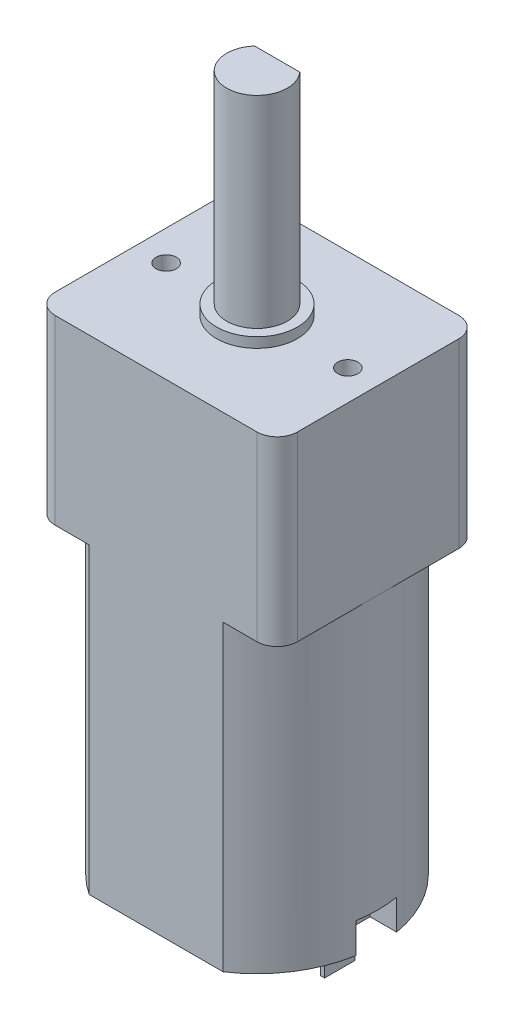
ISO-10303-21;
HEADER;
FILE_DESCRIPTION(('STEP AP214'),'2;1');
FILE_NAME('part.step','',(''),(''),'','','');
FILE_SCHEMA(('AUTOMOTIVE_DESIGN { 1 0 10303 214 1 1 1 1 }'));
ENDSEC;
DATA;
#1=APPLICATION_CONTEXT('core data for automotive mechanical design processes');
#2=APPLICATION_PROTOCOL_DEFINITION('international standard','automotive_design',2000,#1);
#3=PRODUCT_CONTEXT('',#1,'mechanical');
#4=PRODUCT('Part','Part','',(#3));
#5=PRODUCT_RELATED_PRODUCT_CATEGORY('part','',(#4));
#6=PRODUCT_DEFINITION_FORMATION('','',#4);
#7=PRODUCT_DEFINITION_CONTEXT('part definition',#1,'design');
#8=PRODUCT_DEFINITION('design','',#6,#7);
#9=PRODUCT_DEFINITION_SHAPE('','',#8);
#10=(LENGTH_UNIT() NAMED_UNIT(*) SI_UNIT(.MILLI.,.METRE.));
#11=(NAMED_UNIT(*) PLANE_ANGLE_UNIT() SI_UNIT($,.RADIAN.));
#12=(NAMED_UNIT(*) SI_UNIT($,.STERADIAN.) SOLID_ANGLE_UNIT());
#13=UNCERTAINTY_MEASURE_WITH_UNIT(LENGTH_MEASURE(1.E-05),#10,'distance_accuracy_value','');
#14=(GEOMETRIC_REPRESENTATION_CONTEXT(3) GLOBAL_UNCERTAINTY_ASSIGNED_CONTEXT((#13)) GLOBAL_UNIT_ASSIGNED_CONTEXT((#10,
#11,#12)) REPRESENTATION_CONTEXT('',''));
#15=CARTESIAN_POINT('',(0.,0.,0.));
#16=DIRECTION('',(0.,0.,1.));
#17=DIRECTION('',(1.,0.,0.));
#18=AXIS2_PLACEMENT_3D('',#15,#16,#17);
#19=CARTESIAN_POINT('',(5.,24.,-4.));
#20=DIRECTION('',(0.,-1.,0.));
#21=DIRECTION('',(0.,0.,-1.));
#22=AXIS2_PLACEMENT_3D('',#19,#20,#21);
#23=PLANE('',#22);
#24=CARTESIAN_POINT('',(-4.5,24.,0.));
#25=DIRECTION('',(0.,1.,0.));
#26=DIRECTION('',(0.,0.,1.));
#27=AXIS2_PLACEMENT_3D('',#24,#25,#26);
#28=CIRCLE('',#27,0.5);
#29=CARTESIAN_POINT('',(-4.5,24.,0.5));
#30=VERTEX_POINT('',#29);
#31=EDGE_CURVE('E1067',#30,#30,#28,.T.);
#32=ORIENTED_EDGE('',*,*,#31,.F.);
#33=EDGE_LOOP('',(#32));
#34=FACE_BOUND('',#33,.T.);
#35=CARTESIAN_POINT('',(4.5,24.,0.));
#36=DIRECTION('',(0.,1.,0.));
#37=DIRECTION('',(0.,0.,-1.));
#38=AXIS2_PLACEMENT_3D('',#35,#36,#37);
#39=CIRCLE('',#38,0.5);
#40=CARTESIAN_POINT('',(4.5,24.,-0.500000000000001));
#41=VERTEX_POINT('',#40);
#42=EDGE_CURVE('E1077',#41,#41,#39,.T.);
#43=ORIENTED_EDGE('',*,*,#42,.F.);
#44=EDGE_LOOP('',(#43));
#45=FACE_BOUND('',#44,.T.);
#46=CARTESIAN_POINT('',(0.,24.,0.));
#47=DIRECTION('',(0.,-1.,0.));
#48=DIRECTION('',(0.,0.,-1.));
#49=AXIS2_PLACEMENT_3D('',#46,#47,#48);
#50=CIRCLE('',#49,2.);
#51=CARTESIAN_POINT('',(0.,24.,-2.));
#52=VERTEX_POINT('',#51);
#53=EDGE_CURVE('E11',#52,#52,#50,.F.);
#54=ORIENTED_EDGE('',*,*,#53,.F.);
#55=EDGE_LOOP('',(#54));
#56=FACE_BOUND('',#55,.T.);
#57=CARTESIAN_POINT('',(5.,24.,-4.));
#58=DIRECTION('',(0.,1.,0.));
#59=DIRECTION('',(0.,0.,-1.));
#60=AXIS2_PLACEMENT_3D('',#57,#58,#59);
#61=CIRCLE('',#60,1.);
#62=CARTESIAN_POINT('',(6.,24.,-3.99999999999999));
#63=VERTEX_POINT('',#62);
#64=CARTESIAN_POINT('',(4.99999999999999,24.,-5.));
#65=VERTEX_POINT('',#64);
#66=EDGE_CURVE('E280',#63,#65,#61,.T.);
#67=ORIENTED_EDGE('',*,*,#66,.T.);
#68=DIRECTION('',(-1.,0.,0.));
#69=VECTOR('',#68,1.);
#70=CARTESIAN_POINT('',(-4.99999999999999,24.,-5.));
#71=LINE('',#70,#69);
#72=CARTESIAN_POINT('',(-4.99999999999999,24.,-5.));
#73=VERTEX_POINT('',#72);
#74=EDGE_CURVE('E281',#65,#73,#71,.T.);
#75=ORIENTED_EDGE('',*,*,#74,.T.);
#76=CARTESIAN_POINT('',(-5.,24.,-4.));
#77=DIRECTION('',(0.,1.,0.));
#78=DIRECTION('',(0.,0.,1.));
#79=AXIS2_PLACEMENT_3D('',#76,#77,#78);
#80=CIRCLE('',#79,1.);
#81=CARTESIAN_POINT('',(-6.,24.,-3.99999999999999));
#82=VERTEX_POINT('',#81);
#83=EDGE_CURVE('E284',#73,#82,#80,.T.);
#84=ORIENTED_EDGE('',*,*,#83,.T.);
#85=DIRECTION('',(0.,0.,1.));
#86=VECTOR('',#85,1.);
#87=CARTESIAN_POINT('',(-6.,24.,-3.99999999999999));
#88=LINE('',#87,#86);
#89=CARTESIAN_POINT('',(-6.,24.,3.99999999999999));
#90=VERTEX_POINT('',#89);
#91=EDGE_CURVE('E288',#82,#90,#88,.T.);
#92=ORIENTED_EDGE('',*,*,#91,.T.);
#93=CARTESIAN_POINT('',(-5.,24.,4.));
#94=DIRECTION('',(0.,1.,0.));
#95=DIRECTION('',(0.,0.,1.));
#96=AXIS2_PLACEMENT_3D('',#93,#94,#95);
#97=CIRCLE('',#96,1.);
#98=CARTESIAN_POINT('',(-5.,24.,5.));
#99=VERTEX_POINT('',#98);
#100=EDGE_CURVE('E292',#90,#99,#97,.T.);
#101=ORIENTED_EDGE('',*,*,#100,.T.);
#102=DIRECTION('',(1.,0.,0.));
#103=VECTOR('',#102,1.);
#104=CARTESIAN_POINT('',(-4.99999999999999,24.,5.));
#105=LINE('',#104,#103);
#106=CARTESIAN_POINT('',(4.99999999999999,24.,5.));
#107=VERTEX_POINT('',#106);
#108=EDGE_CURVE('E294',#99,#107,#105,.T.);
#109=ORIENTED_EDGE('',*,*,#108,.T.);
#110=CARTESIAN_POINT('',(5.,24.,4.));
#111=DIRECTION('',(0.,1.,0.));
#112=DIRECTION('',(0.,0.,1.));
#113=AXIS2_PLACEMENT_3D('',#110,#111,#112);
#114=CIRCLE('',#113,1.);
#115=CARTESIAN_POINT('',(6.,24.,3.99999999999999));
#116=VERTEX_POINT('',#115);
#117=EDGE_CURVE('E296',#107,#116,#114,.T.);
#118=ORIENTED_EDGE('',*,*,#117,.T.);
#119=DIRECTION('',(0.,0.,-1.));
#120=VECTOR('',#119,1.);
#121=CARTESIAN_POINT('',(6.,24.,-3.99999999999999));
#122=LINE('',#121,#120);
#123=EDGE_CURVE('E297',#116,#63,#122,.T.);
#124=ORIENTED_EDGE('',*,*,#123,.T.);
#125=EDGE_LOOP('',(#67,#75,#84,#92,#101,#109,#118,#124));
#126=FACE_BOUND('',#125,.T.);
#127=ADVANCED_FACE('F42',(#34,#45,#56,#126),#23,.F.);
#128=CARTESIAN_POINT('',(0.,0.,0.));
#129=DIRECTION('',(0.,1.,0.));
#130=DIRECTION('',(0.,0.,1.));
#131=AXIS2_PLACEMENT_3D('',#128,#129,#130);
#132=PLANE('',#131);
#133=DIRECTION('',(0.,0.,1.));
#134=VECTOR('',#133,1.);
#135=CARTESIAN_POINT('',(4.1,0.,0.750000000000001));
#136=LINE('',#135,#134);
#137=CARTESIAN_POINT('',(4.1,0.,-0.75));
#138=VERTEX_POINT('',#137);
#139=CARTESIAN_POINT('',(4.1,0.,0.750000000000001));
#140=VERTEX_POINT('',#139);
#141=EDGE_CURVE('E437',#138,#140,#136,.T.);
#142=ORIENTED_EDGE('',*,*,#141,.F.);
#143=DIRECTION('',(1.,0.,0.));
#144=VECTOR('',#143,1.);
#145=CARTESIAN_POINT('',(4.1,0.,-0.75));
#146=LINE('',#145,#144);
#147=CARTESIAN_POINT('',(3.9,0.,-0.75));
#148=VERTEX_POINT('',#147);
#149=EDGE_CURVE('E481',#148,#138,#146,.T.);
#150=ORIENTED_EDGE('',*,*,#149,.F.);
#151=DIRECTION('',(0.,0.,-1.));
#152=VECTOR('',#151,1.);
#153=CARTESIAN_POINT('',(3.9,0.,0.750000000000001));
#154=LINE('',#153,#152);
#155=CARTESIAN_POINT('',(3.9,0.,0.750000000000001));
#156=VERTEX_POINT('',#155);
#157=EDGE_CURVE('E484',#156,#148,#154,.T.);
#158=ORIENTED_EDGE('',*,*,#157,.F.);
#159=DIRECTION('',(-1.,0.,0.));
#160=VECTOR('',#159,1.);
#161=CARTESIAN_POINT('',(4.1,0.,0.750000000000001));
#162=LINE('',#161,#160);
#163=EDGE_CURVE('E489',#140,#156,#162,.T.);
#164=ORIENTED_EDGE('',*,*,#163,.F.);
#165=EDGE_LOOP('',(#142,#150,#158,#164));
#166=FACE_BOUND('',#165,.T.);
#167=CARTESIAN_POINT('',(0.,0.,0.));
#168=DIRECTION('',(0.,-1.,0.));
#169=DIRECTION('',(0.,0.,-1.));
#170=AXIS2_PLACEMENT_3D('',#167,#168,#169);
#171=CIRCLE('',#170,2.5);
#172=CARTESIAN_POINT('',(0.,0.,-2.5));
#173=VERTEX_POINT('',#172);
#174=EDGE_CURVE('E515',#173,#173,#171,.T.);
#175=ORIENTED_EDGE('',*,*,#174,.F.);
#176=EDGE_LOOP('',(#175));
#177=FACE_BOUND('',#176,.T.);
#178=DIRECTION('',(0.,0.,-1.));
#179=VECTOR('',#178,1.);
#180=CARTESIAN_POINT('',(-4.1,0.,0.75));
#181=LINE('',#180,#179);
#182=CARTESIAN_POINT('',(-4.1,0.,0.75));
#183=VERTEX_POINT('',#182);
#184=CARTESIAN_POINT('',(-4.1,0.,-0.75));
#185=VERTEX_POINT('',#184);
#186=EDGE_CURVE('E433',#183,#185,#181,.T.);
#187=ORIENTED_EDGE('',*,*,#186,.F.);
#188=DIRECTION('',(-1.,0.,0.));
#189=VECTOR('',#188,1.);
#190=CARTESIAN_POINT('',(-4.1,0.,0.75));
#191=LINE('',#190,#189);
#192=CARTESIAN_POINT('',(-3.9,0.,0.75));
#193=VERTEX_POINT('',#192);
#194=EDGE_CURVE('E421',#193,#183,#191,.T.);
#195=ORIENTED_EDGE('',*,*,#194,.F.);
#196=DIRECTION('',(0.,0.,1.));
#197=VECTOR('',#196,1.);
#198=CARTESIAN_POINT('',(-3.9,0.,0.75));
#199=LINE('',#198,#197);
#200=CARTESIAN_POINT('',(-3.9,0.,-0.75));
#201=VERTEX_POINT('',#200);
#202=EDGE_CURVE('E445',#201,#193,#199,.T.);
#203=ORIENTED_EDGE('',*,*,#202,.F.);
#204=DIRECTION('',(1.,0.,0.));
#205=VECTOR('',#204,1.);
#206=CARTESIAN_POINT('',(-4.1,0.,-0.75));
#207=LINE('',#206,#205);
#208=EDGE_CURVE('E440',#185,#201,#207,.T.);
#209=ORIENTED_EDGE('',*,*,#208,.F.);
#210=EDGE_LOOP('',(#187,#195,#203,#209));
#211=FACE_BOUND('',#210,.T.);
#212=DIRECTION('',(1.,0.,0.));
#213=VECTOR('',#212,1.);
#214=CARTESIAN_POINT('',(-6.,0.,-1.));
#215=LINE('',#214,#213);
#216=CARTESIAN_POINT('',(-5.91607978309962,0.,-1.));
#217=VERTEX_POINT('',#216);
#218=CARTESIAN_POINT('',(-4.6,0.,-1.));
#219=VERTEX_POINT('',#218);
#220=EDGE_CURVE('E376',#217,#219,#215,.T.);
#221=ORIENTED_EDGE('',*,*,#220,.F.);
#222=CARTESIAN_POINT('',(0.,0.,0.));
#223=DIRECTION('',(0.,1.,0.));
#224=DIRECTION('',(0.,0.,1.));
#225=AXIS2_PLACEMENT_3D('',#222,#223,#224);
#226=CIRCLE('',#225,6.);
#227=CARTESIAN_POINT('',(-3.3166247903554,0.,-5.));
#228=VERTEX_POINT('',#227);
#229=EDGE_CURVE('E527',#228,#217,#226,.T.);
#230=ORIENTED_EDGE('',*,*,#229,.F.);
#231=DIRECTION('',(-1.,0.,0.));
#232=VECTOR('',#231,1.);
#233=CARTESIAN_POINT('',(-3.3166247903554,0.,-5.));
#234=LINE('',#233,#232);
#235=CARTESIAN_POINT('',(3.3166247903554,0.,-5.));
#236=VERTEX_POINT('',#235);
#237=EDGE_CURVE('E537',#236,#228,#234,.T.);
#238=ORIENTED_EDGE('',*,*,#237,.F.);
#239=CARTESIAN_POINT('',(0.,0.,0.));
#240=DIRECTION('',(0.,1.,0.));
#241=DIRECTION('',(0.,0.,1.));
#242=AXIS2_PLACEMENT_3D('',#239,#240,#241);
#243=CIRCLE('',#242,6.);
#244=CARTESIAN_POINT('',(5.91607978309962,0.,-1.));
#245=VERTEX_POINT('',#244);
#246=EDGE_CURVE('E534',#245,#236,#243,.T.);
#247=ORIENTED_EDGE('',*,*,#246,.F.);
#248=DIRECTION('',(1.,0.,0.));
#249=VECTOR('',#248,1.);
#250=CARTESIAN_POINT('',(6.,0.,-1.));
#251=LINE('',#250,#249);
#252=CARTESIAN_POINT('',(4.6,0.,-1.));
#253=VERTEX_POINT('',#252);
#254=EDGE_CURVE('E399',#253,#245,#251,.T.);
#255=ORIENTED_EDGE('',*,*,#254,.F.);
#256=DIRECTION('',(0.,0.,-1.));
#257=VECTOR('',#256,1.);
#258=CARTESIAN_POINT('',(4.6,0.,1.));
#259=LINE('',#258,#257);
#260=CARTESIAN_POINT('',(4.6,0.,1.));
#261=VERTEX_POINT('',#260);
#262=EDGE_CURVE('E401',#261,#253,#259,.T.);
#263=ORIENTED_EDGE('',*,*,#262,.F.);
#264=DIRECTION('',(-1.,0.,0.));
#265=VECTOR('',#264,1.);
#266=CARTESIAN_POINT('',(6.,0.,1.));
#267=LINE('',#266,#265);
#268=CARTESIAN_POINT('',(5.91607978309962,0.,1.));
#269=VERTEX_POINT('',#268);
#270=EDGE_CURVE('E379',#269,#261,#267,.T.);
#271=ORIENTED_EDGE('',*,*,#270,.F.);
#272=CARTESIAN_POINT('',(3.3166247903554,0.,5.));
#273=VERTEX_POINT('',#272);
#274=EDGE_CURVE('E532',#273,#269,#243,.T.);
#275=ORIENTED_EDGE('',*,*,#274,.F.);
#276=DIRECTION('',(1.,0.,0.));
#277=VECTOR('',#276,1.);
#278=CARTESIAN_POINT('',(-3.3166247903554,0.,5.));
#279=LINE('',#278,#277);
#280=CARTESIAN_POINT('',(-3.3166247903554,0.,5.));
#281=VERTEX_POINT('',#280);
#282=EDGE_CURVE('E533',#281,#273,#279,.T.);
#283=ORIENTED_EDGE('',*,*,#282,.F.);
#284=CARTESIAN_POINT('',(-5.91607978309962,0.,1.));
#285=VERTEX_POINT('',#284);
#286=EDGE_CURVE('E512',#285,#281,#226,.T.);
#287=ORIENTED_EDGE('',*,*,#286,.F.);
#288=DIRECTION('',(-1.,0.,0.));
#289=VECTOR('',#288,1.);
#290=CARTESIAN_POINT('',(-6.,0.,1.));
#291=LINE('',#290,#289);
#292=CARTESIAN_POINT('',(-4.6,0.,1.));
#293=VERTEX_POINT('',#292);
#294=EDGE_CURVE('E370',#293,#285,#291,.T.);
#295=ORIENTED_EDGE('',*,*,#294,.F.);
#296=DIRECTION('',(0.,0.,1.));
#297=VECTOR('',#296,1.);
#298=CARTESIAN_POINT('',(-4.6,0.,1.));
#299=LINE('',#298,#297);
#300=EDGE_CURVE('E377',#219,#293,#299,.T.);
#301=ORIENTED_EDGE('',*,*,#300,.F.);
#302=EDGE_LOOP('',(#221,#230,#238,#247,#255,#263,#271,#275,#283,#287,#295,#301));
#303=FACE_BOUND('',#302,.T.);
#304=ADVANCED_FACE('F584',(#166,#177,#211,#303),#132,.F.);
#305=CARTESIAN_POINT('',(0.,15.,0.));
#306=DIRECTION('',(0.,-1.,0.));
#307=DIRECTION('',(0.,0.,-1.));
#308=AXIS2_PLACEMENT_3D('',#305,#306,#307);
#309=CYLINDRICAL_SURFACE('',#308,6.);
#310=CARTESIAN_POINT('',(0.,1.5,0.));
#311=DIRECTION('',(0.,-1.,0.));
#312=DIRECTION('',(0.,0.,-1.));
#313=AXIS2_PLACEMENT_3D('',#310,#311,#312);
#314=CIRCLE('',#313,6.);
#315=CARTESIAN_POINT('',(-5.91607978309962,1.5,1.));
#316=VERTEX_POINT('',#315);
#317=CARTESIAN_POINT('',(-5.91607978309962,1.5,-1.));
#318=VERTEX_POINT('',#317);
#319=EDGE_CURVE('E570',#316,#318,#314,.T.);
#320=ORIENTED_EDGE('',*,*,#319,.F.);
#321=DIRECTION('',(0.,-1.,0.));
#322=VECTOR('',#321,1.);
#323=CARTESIAN_POINT('',(-5.91607978309962,15.,1.));
#324=LINE('',#323,#322);
#325=EDGE_CURVE('E252',#316,#285,#324,.T.);
#326=ORIENTED_EDGE('',*,*,#325,.T.);
#327=ORIENTED_EDGE('',*,*,#286,.T.);
#328=DIRECTION('',(0.,-1.,0.));
#329=VECTOR('',#328,1.);
#330=CARTESIAN_POINT('',(-3.3166247903554,15.,5.));
#331=LINE('',#330,#329);
#332=CARTESIAN_POINT('',(-3.3166247903554,15.,5.));
#333=VERTEX_POINT('',#332);
#334=EDGE_CURVE('E516',#333,#281,#331,.T.);
#335=ORIENTED_EDGE('',*,*,#334,.F.);
#336=CARTESIAN_POINT('',(0.,15.,0.));
#337=DIRECTION('',(0.,1.,0.));
#338=DIRECTION('',(0.,0.,1.));
#339=AXIS2_PLACEMENT_3D('',#336,#337,#338);
#340=CIRCLE('',#339,6.);
#341=CARTESIAN_POINT('',(-6.,15.,0.));
#342=VERTEX_POINT('',#341);
#343=EDGE_CURVE('E525',#342,#333,#340,.T.);
#344=ORIENTED_EDGE('',*,*,#343,.F.);
#345=CARTESIAN_POINT('',(-3.3166247903554,15.,-5.));
#346=VERTEX_POINT('',#345);
#347=EDGE_CURVE('E520',#346,#342,#340,.T.);
#348=ORIENTED_EDGE('',*,*,#347,.F.);
#349=DIRECTION('',(0.,-1.,0.));
#350=VECTOR('',#349,1.);
#351=CARTESIAN_POINT('',(-3.3166247903554,15.,-5.));
#352=LINE('',#351,#350);
#353=EDGE_CURVE('E528',#346,#228,#352,.T.);
#354=ORIENTED_EDGE('',*,*,#353,.T.);
#355=ORIENTED_EDGE('',*,*,#229,.T.);
#356=DIRECTION('',(0.,-1.,0.));
#357=VECTOR('',#356,1.);
#358=CARTESIAN_POINT('',(-5.91607978309962,15.,-1.));
#359=LINE('',#358,#357);
#360=EDGE_CURVE('E568',#217,#318,#359,.F.);
#361=ORIENTED_EDGE('',*,*,#360,.T.);
#362=EDGE_LOOP('',(#320,#326,#327,#335,#344,#348,#354,#355,#361));
#363=FACE_BOUND('',#362,.T.);
#364=ADVANCED_FACE('F46',(#363),#309,.T.);
#365=CARTESIAN_POINT('',(-3.3166247903554,15.,5.));
#366=DIRECTION('',(0.,0.,-1.));
#367=DIRECTION('',(-1.,0.,0.));
#368=AXIS2_PLACEMENT_3D('',#365,#366,#367);
#369=PLANE('',#368);
#370=ORIENTED_EDGE('',*,*,#282,.T.);
#371=DIRECTION('',(0.,-1.,0.));
#372=VECTOR('',#371,1.);
#373=CARTESIAN_POINT('',(3.3166247903554,15.,5.));
#374=LINE('',#373,#372);
#375=CARTESIAN_POINT('',(3.3166247903554,15.,5.));
#376=VERTEX_POINT('',#375);
#377=EDGE_CURVE('E548',#376,#273,#374,.T.);
#378=ORIENTED_EDGE('',*,*,#377,.F.);
#379=DIRECTION('',(1.,0.,0.));
#380=VECTOR('',#379,1.);
#381=CARTESIAN_POINT('',(-4.99999999999999,15.,5.));
#382=LINE('',#381,#380);
#383=CARTESIAN_POINT('',(4.99999999999999,15.,5.));
#384=VERTEX_POINT('',#383);
#385=EDGE_CURVE('E317',#376,#384,#382,.T.);
#386=ORIENTED_EDGE('',*,*,#385,.T.);
#387=DIRECTION('',(0.,-1.,0.));
#388=VECTOR('',#387,1.);
#389=CARTESIAN_POINT('',(4.99999999999999,24.,5.));
#390=LINE('',#389,#388);
#391=EDGE_CURVE('E337',#107,#384,#390,.T.);
#392=ORIENTED_EDGE('',*,*,#391,.F.);
#393=ORIENTED_EDGE('',*,*,#108,.F.);
#394=DIRECTION('',(0.,-1.,0.));
#395=VECTOR('',#394,1.);
#396=CARTESIAN_POINT('',(-5.,24.,5.));
#397=LINE('',#396,#395);
#398=CARTESIAN_POINT('',(-5.,15.,5.));
#399=VERTEX_POINT('',#398);
#400=EDGE_CURVE('E345',#99,#399,#397,.T.);
#401=ORIENTED_EDGE('',*,*,#400,.T.);
#402=EDGE_CURVE('E319',#399,#333,#382,.T.);
#403=ORIENTED_EDGE('',*,*,#402,.T.);
#404=ORIENTED_EDGE('',*,*,#334,.T.);
#405=EDGE_LOOP('',(#370,#378,#386,#392,#393,#401,#403,#404));
#406=FACE_BOUND('',#405,.T.);
#407=ADVANCED_FACE('F636',(#406),#369,.F.);
#408=CARTESIAN_POINT('',(0.,15.,0.));
#409=DIRECTION('',(0.,-1.,0.));
#410=DIRECTION('',(0.,0.,-1.));
#411=AXIS2_PLACEMENT_3D('',#408,#409,#410);
#412=CYLINDRICAL_SURFACE('',#411,6.);
#413=CARTESIAN_POINT('',(0.,1.5,0.));
#414=DIRECTION('',(0.,1.,0.));
#415=DIRECTION('',(0.,0.,1.));
#416=AXIS2_PLACEMENT_3D('',#413,#414,#415);
#417=CIRCLE('',#416,6.);
#418=CARTESIAN_POINT('',(5.91607978309962,1.5,1.));
#419=VERTEX_POINT('',#418);
#420=CARTESIAN_POINT('',(5.91607978309962,1.5,-1.));
#421=VERTEX_POINT('',#420);
#422=EDGE_CURVE('E519',#419,#421,#417,.T.);
#423=ORIENTED_EDGE('',*,*,#422,.T.);
#424=DIRECTION('',(0.,-1.,0.));
#425=VECTOR('',#424,1.);
#426=CARTESIAN_POINT('',(5.91607978309962,15.,-1.));
#427=LINE('',#426,#425);
#428=EDGE_CURVE('E563',#421,#245,#427,.T.);
#429=ORIENTED_EDGE('',*,*,#428,.T.);
#430=ORIENTED_EDGE('',*,*,#246,.T.);
#431=DIRECTION('',(0.,-1.,0.));
#432=VECTOR('',#431,1.);
#433=CARTESIAN_POINT('',(3.3166247903554,15.,-5.));
#434=LINE('',#433,#432);
#435=CARTESIAN_POINT('',(3.3166247903554,15.,-5.));
#436=VERTEX_POINT('',#435);
#437=EDGE_CURVE('E544',#436,#236,#434,.T.);
#438=ORIENTED_EDGE('',*,*,#437,.F.);
#439=CARTESIAN_POINT('',(0.,15.,0.));
#440=DIRECTION('',(0.,1.,0.));
#441=DIRECTION('',(0.,0.,1.));
#442=AXIS2_PLACEMENT_3D('',#439,#440,#441);
#443=CIRCLE('',#442,6.);
#444=CARTESIAN_POINT('',(6.,15.,0.));
#445=VERTEX_POINT('',#444);
#446=EDGE_CURVE('E70',#445,#436,#443,.T.);
#447=ORIENTED_EDGE('',*,*,#446,.F.);
#448=EDGE_CURVE('E523',#376,#445,#443,.T.);
#449=ORIENTED_EDGE('',*,*,#448,.F.);
#450=ORIENTED_EDGE('',*,*,#377,.T.);
#451=ORIENTED_EDGE('',*,*,#274,.T.);
#452=DIRECTION('',(0.,-1.,0.));
#453=VECTOR('',#452,1.);
#454=CARTESIAN_POINT('',(5.91607978309962,15.,1.));
#455=LINE('',#454,#453);
#456=EDGE_CURVE('E558',#269,#419,#455,.F.);
#457=ORIENTED_EDGE('',*,*,#456,.T.);
#458=EDGE_LOOP('',(#423,#429,#430,#438,#447,#449,#450,#451,#457));
#459=FACE_BOUND('',#458,.T.);
#460=ADVANCED_FACE('F630',(#459),#412,.T.);
#461=CARTESIAN_POINT('',(-3.3166247903554,15.,-5.));
#462=DIRECTION('',(0.,0.,1.));
#463=DIRECTION('',(1.,0.,0.));
#464=AXIS2_PLACEMENT_3D('',#461,#462,#463);
#465=PLANE('',#464);
#466=ORIENTED_EDGE('',*,*,#237,.T.);
#467=ORIENTED_EDGE('',*,*,#353,.F.);
#468=DIRECTION('',(-1.,0.,0.));
#469=VECTOR('',#468,1.);
#470=CARTESIAN_POINT('',(-4.99999999999999,15.,-5.));
#471=LINE('',#470,#469);
#472=CARTESIAN_POINT('',(-4.99999999999999,15.,-5.));
#473=VERTEX_POINT('',#472);
#474=EDGE_CURVE('E275',#346,#473,#471,.T.);
#475=ORIENTED_EDGE('',*,*,#474,.T.);
#476=DIRECTION('',(0.,-1.,0.));
#477=VECTOR('',#476,1.);
#478=CARTESIAN_POINT('',(-4.99999999999999,24.,-5.));
#479=LINE('',#478,#477);
#480=EDGE_CURVE('E353',#73,#473,#479,.T.);
#481=ORIENTED_EDGE('',*,*,#480,.F.);
#482=ORIENTED_EDGE('',*,*,#74,.F.);
#483=DIRECTION('',(0.,-1.,0.));
#484=VECTOR('',#483,1.);
#485=CARTESIAN_POINT('',(4.99999999999999,24.,-5.));
#486=LINE('',#485,#484);
#487=CARTESIAN_POINT('',(4.99999999999999,15.,-5.));
#488=VERTEX_POINT('',#487);
#489=EDGE_CURVE('E358',#65,#488,#486,.T.);
#490=ORIENTED_EDGE('',*,*,#489,.T.);
#491=EDGE_CURVE('E304',#488,#436,#471,.T.);
#492=ORIENTED_EDGE('',*,*,#491,.T.);
#493=ORIENTED_EDGE('',*,*,#437,.T.);
#494=EDGE_LOOP('',(#466,#467,#475,#481,#482,#490,#492,#493));
#495=FACE_BOUND('',#494,.T.);
#496=ADVANCED_FACE('F596',(#495),#465,.F.);
#497=CARTESIAN_POINT('',(0.,-1.2,0.));
#498=DIRECTION('',(0.,1.,0.));
#499=DIRECTION('',(0.,0.,1.));
#500=AXIS2_PLACEMENT_3D('',#497,#498,#499);
#501=CYLINDRICAL_SURFACE('',#500,2.5);
#502=CARTESIAN_POINT('',(0.,-1.2,0.));
#503=DIRECTION('',(0.,-1.,0.));
#504=DIRECTION('',(0.,0.,-1.));
#505=AXIS2_PLACEMENT_3D('',#502,#503,#504);
#506=CIRCLE('',#505,2.5);
#507=CARTESIAN_POINT('',(0.,-1.2,-2.5));
#508=VERTEX_POINT('',#507);
#509=EDGE_CURVE('E463',#508,#508,#506,.T.);
#510=ORIENTED_EDGE('',*,*,#509,.F.);
#511=EDGE_LOOP('',(#510));
#512=FACE_BOUND('',#511,.T.);
#513=ORIENTED_EDGE('',*,*,#174,.T.);
#514=EDGE_LOOP('',(#513));
#515=FACE_BOUND('',#514,.T.);
#516=ADVANCED_FACE('F750',(#512,#515),#501,.T.);
#517=CARTESIAN_POINT('',(0.,-1.2,0.));
#518=DIRECTION('',(0.,-1.,0.));
#519=DIRECTION('',(0.,0.,-1.));
#520=AXIS2_PLACEMENT_3D('',#517,#518,#519);
#521=PLANE('',#520);
#522=ORIENTED_EDGE('',*,*,#509,.T.);
#523=EDGE_LOOP('',(#522));
#524=FACE_BOUND('',#523,.T.);
#525=ADVANCED_FACE('F732',(#524),#521,.T.);
#526=CARTESIAN_POINT('',(4.1,-2.,0.750000000000001));
#527=DIRECTION('',(-1.,0.,0.));
#528=DIRECTION('',(0.,0.,1.));
#529=AXIS2_PLACEMENT_3D('',#526,#527,#528);
#530=PLANE('',#529);
#531=ORIENTED_EDGE('',*,*,#141,.T.);
#532=DIRECTION('',(0.,1.,0.));
#533=VECTOR('',#532,1.);
#534=CARTESIAN_POINT('',(4.1,-2.,0.750000000000001));
#535=LINE('',#534,#533);
#536=CARTESIAN_POINT('',(4.1,-2.,0.750000000000001));
#537=VERTEX_POINT('',#536);
#538=EDGE_CURVE('E386',#537,#140,#535,.T.);
#539=ORIENTED_EDGE('',*,*,#538,.F.);
#540=DIRECTION('',(0.,0.,1.));
#541=VECTOR('',#540,1.);
#542=CARTESIAN_POINT('',(4.1,-2.,0.750000000000001));
#543=LINE('',#542,#541);
#544=CARTESIAN_POINT('',(4.1,-2.,-0.75));
#545=VERTEX_POINT('',#544);
#546=EDGE_CURVE('E486',#545,#537,#543,.T.);
#547=ORIENTED_EDGE('',*,*,#546,.F.);
#548=DIRECTION('',(0.,1.,0.));
#549=VECTOR('',#548,1.);
#550=CARTESIAN_POINT('',(4.1,-2.,-0.75));
#551=LINE('',#550,#549);
#552=EDGE_CURVE('E478',#545,#138,#551,.T.);
#553=ORIENTED_EDGE('',*,*,#552,.T.);
#554=EDGE_LOOP('',(#531,#539,#547,#553));
#555=FACE_BOUND('',#554,.T.);
#556=ADVANCED_FACE('F730',(#555),#530,.F.);
#557=CARTESIAN_POINT('',(4.1,-2.,0.750000000000001));
#558=DIRECTION('',(0.,0.,-1.));
#559=DIRECTION('',(-1.,0.,0.));
#560=AXIS2_PLACEMENT_3D('',#557,#558,#559);
#561=PLANE('',#560);
#562=ORIENTED_EDGE('',*,*,#163,.T.);
#563=DIRECTION('',(0.,1.,0.));
#564=VECTOR('',#563,1.);
#565=CARTESIAN_POINT('',(3.9,-2.,0.750000000000001));
#566=LINE('',#565,#564);
#567=CARTESIAN_POINT('',(3.9,-2.,0.750000000000001));
#568=VERTEX_POINT('',#567);
#569=EDGE_CURVE('E468',#568,#156,#566,.T.);
#570=ORIENTED_EDGE('',*,*,#569,.F.);
#571=DIRECTION('',(-1.,0.,0.));
#572=VECTOR('',#571,1.);
#573=CARTESIAN_POINT('',(4.1,-2.,0.750000000000001));
#574=LINE('',#573,#572);
#575=EDGE_CURVE('E505',#537,#568,#574,.T.);
#576=ORIENTED_EDGE('',*,*,#575,.F.);
#577=ORIENTED_EDGE('',*,*,#538,.T.);
#578=EDGE_LOOP('',(#562,#570,#576,#577));
#579=FACE_BOUND('',#578,.T.);
#580=ADVANCED_FACE('F729',(#579),#561,.F.);
#581=CARTESIAN_POINT('',(3.9,-2.,0.750000000000001));
#582=DIRECTION('',(1.,0.,0.));
#583=DIRECTION('',(0.,0.,-1.));
#584=AXIS2_PLACEMENT_3D('',#581,#582,#583);
#585=PLANE('',#584);
#586=ORIENTED_EDGE('',*,*,#157,.T.);
#587=DIRECTION('',(0.,1.,0.));
#588=VECTOR('',#587,1.);
#589=CARTESIAN_POINT('',(3.9,-2.,-0.75));
#590=LINE('',#589,#588);
#591=CARTESIAN_POINT('',(3.9,-2.,-0.75));
#592=VERTEX_POINT('',#591);
#593=EDGE_CURVE('E472',#592,#148,#590,.T.);
#594=ORIENTED_EDGE('',*,*,#593,.F.);
#595=DIRECTION('',(0.,0.,-1.));
#596=VECTOR('',#595,1.);
#597=CARTESIAN_POINT('',(3.9,-2.,0.750000000000001));
#598=LINE('',#597,#596);
#599=EDGE_CURVE('E496',#568,#592,#598,.T.);
#600=ORIENTED_EDGE('',*,*,#599,.F.);
#601=ORIENTED_EDGE('',*,*,#569,.T.);
#602=EDGE_LOOP('',(#586,#594,#600,#601));
#603=FACE_BOUND('',#602,.T.);
#604=ADVANCED_FACE('F733',(#603),#585,.F.);
#605=CARTESIAN_POINT('',(4.1,-2.,-0.75));
#606=DIRECTION('',(0.,0.,1.));
#607=DIRECTION('',(1.,0.,0.));
#608=AXIS2_PLACEMENT_3D('',#605,#606,#607);
#609=PLANE('',#608);
#610=ORIENTED_EDGE('',*,*,#149,.T.);
#611=ORIENTED_EDGE('',*,*,#552,.F.);
#612=DIRECTION('',(1.,0.,0.));
#613=VECTOR('',#612,1.);
#614=CARTESIAN_POINT('',(4.1,-2.,-0.75));
#615=LINE('',#614,#613);
#616=EDGE_CURVE('E477',#592,#545,#615,.T.);
#617=ORIENTED_EDGE('',*,*,#616,.F.);
#618=ORIENTED_EDGE('',*,*,#593,.T.);
#619=EDGE_LOOP('',(#610,#611,#617,#618));
#620=FACE_BOUND('',#619,.T.);
#621=ADVANCED_FACE('F738',(#620),#609,.F.);
#622=CARTESIAN_POINT('',(0.,-2.,0.));
#623=DIRECTION('',(0.,1.,0.));
#624=DIRECTION('',(0.,0.,1.));
#625=AXIS2_PLACEMENT_3D('',#622,#623,#624);
#626=PLANE('',#625);
#627=ORIENTED_EDGE('',*,*,#546,.T.);
#628=ORIENTED_EDGE('',*,*,#575,.T.);
#629=ORIENTED_EDGE('',*,*,#599,.T.);
#630=ORIENTED_EDGE('',*,*,#616,.T.);
#631=EDGE_LOOP('',(#627,#628,#629,#630));
#632=FACE_BOUND('',#631,.T.);
#633=ADVANCED_FACE('F724',(#632),#626,.F.);
#634=CARTESIAN_POINT('',(-4.1,-2.,0.75));
#635=DIRECTION('',(1.,0.,0.));
#636=DIRECTION('',(0.,0.,-1.));
#637=AXIS2_PLACEMENT_3D('',#634,#635,#636);
#638=PLANE('',#637);
#639=ORIENTED_EDGE('',*,*,#186,.T.);
#640=DIRECTION('',(0.,1.,0.));
#641=VECTOR('',#640,1.);
#642=CARTESIAN_POINT('',(-4.1,-2.,-0.75));
#643=LINE('',#642,#641);
#644=CARTESIAN_POINT('',(-4.1,-2.,-0.75));
#645=VERTEX_POINT('',#644);
#646=EDGE_CURVE('E458',#645,#185,#643,.T.);
#647=ORIENTED_EDGE('',*,*,#646,.F.);
#648=DIRECTION('',(0.,0.,-1.));
#649=VECTOR('',#648,1.);
#650=CARTESIAN_POINT('',(-4.1,-2.,0.75));
#651=LINE('',#650,#649);
#652=CARTESIAN_POINT('',(-4.1,-2.,0.75));
#653=VERTEX_POINT('',#652);
#654=EDGE_CURVE('E416',#653,#645,#651,.T.);
#655=ORIENTED_EDGE('',*,*,#654,.F.);
#656=DIRECTION('',(0.,1.,0.));
#657=VECTOR('',#656,1.);
#658=CARTESIAN_POINT('',(-4.1,-2.,0.75));
#659=LINE('',#658,#657);
#660=EDGE_CURVE('E435',#653,#183,#659,.T.);
#661=ORIENTED_EDGE('',*,*,#660,.T.);
#662=EDGE_LOOP('',(#639,#647,#655,#661));
#663=FACE_BOUND('',#662,.T.);
#664=ADVANCED_FACE('F721',(#663),#638,.F.);
#665=CARTESIAN_POINT('',(-4.1,-2.,-0.75));
#666=DIRECTION('',(0.,0.,1.));
#667=DIRECTION('',(1.,0.,0.));
#668=AXIS2_PLACEMENT_3D('',#665,#666,#667);
#669=PLANE('',#668);
#670=ORIENTED_EDGE('',*,*,#208,.T.);
#671=DIRECTION('',(0.,1.,0.));
#672=VECTOR('',#671,1.);
#673=CARTESIAN_POINT('',(-3.9,-2.,-0.75));
#674=LINE('',#673,#672);
#675=CARTESIAN_POINT('',(-3.9,-2.,-0.75));
#676=VERTEX_POINT('',#675);
#677=EDGE_CURVE('E457',#676,#201,#674,.T.);
#678=ORIENTED_EDGE('',*,*,#677,.F.);
#679=DIRECTION('',(1.,0.,0.));
#680=VECTOR('',#679,1.);
#681=CARTESIAN_POINT('',(-4.1,-2.,-0.75));
#682=LINE('',#681,#680);
#683=EDGE_CURVE('E425',#645,#676,#682,.T.);
#684=ORIENTED_EDGE('',*,*,#683,.F.);
#685=ORIENTED_EDGE('',*,*,#646,.T.);
#686=EDGE_LOOP('',(#670,#678,#684,#685));
#687=FACE_BOUND('',#686,.T.);
#688=ADVANCED_FACE('F720',(#687),#669,.F.);
#689=CARTESIAN_POINT('',(-3.9,-2.,0.75));
#690=DIRECTION('',(-1.,0.,0.));
#691=DIRECTION('',(0.,0.,1.));
#692=AXIS2_PLACEMENT_3D('',#689,#690,#691);
#693=PLANE('',#692);
#694=ORIENTED_EDGE('',*,*,#202,.T.);
#695=DIRECTION('',(0.,1.,0.));
#696=VECTOR('',#695,1.);
#697=CARTESIAN_POINT('',(-3.9,-2.,0.75));
#698=LINE('',#697,#696);
#699=CARTESIAN_POINT('',(-3.9,-2.,0.75));
#700=VERTEX_POINT('',#699);
#701=EDGE_CURVE('E455',#700,#193,#698,.T.);
#702=ORIENTED_EDGE('',*,*,#701,.F.);
#703=DIRECTION('',(0.,0.,1.));
#704=VECTOR('',#703,1.);
#705=CARTESIAN_POINT('',(-3.9,-2.,0.75));
#706=LINE('',#705,#704);
#707=EDGE_CURVE('E426',#676,#700,#706,.T.);
#708=ORIENTED_EDGE('',*,*,#707,.F.);
#709=ORIENTED_EDGE('',*,*,#677,.T.);
#710=EDGE_LOOP('',(#694,#702,#708,#709));
#711=FACE_BOUND('',#710,.T.);
#712=ADVANCED_FACE('F712',(#711),#693,.F.);
#713=CARTESIAN_POINT('',(-4.1,-2.,0.75));
#714=DIRECTION('',(0.,0.,-1.));
#715=DIRECTION('',(-1.,0.,0.));
#716=AXIS2_PLACEMENT_3D('',#713,#714,#715);
#717=PLANE('',#716);
#718=ORIENTED_EDGE('',*,*,#194,.T.);
#719=ORIENTED_EDGE('',*,*,#660,.F.);
#720=DIRECTION('',(-1.,0.,0.));
#721=VECTOR('',#720,1.);
#722=CARTESIAN_POINT('',(-4.1,-2.,0.75));
#723=LINE('',#722,#721);
#724=EDGE_CURVE('E427',#700,#653,#723,.T.);
#725=ORIENTED_EDGE('',*,*,#724,.F.);
#726=ORIENTED_EDGE('',*,*,#701,.T.);
#727=EDGE_LOOP('',(#718,#719,#725,#726));
#728=FACE_BOUND('',#727,.T.);
#729=ADVANCED_FACE('F702',(#728),#717,.F.);
#730=CARTESIAN_POINT('',(0.,-2.,0.));
#731=DIRECTION('',(0.,-1.,0.));
#732=DIRECTION('',(0.,0.,-1.));
#733=AXIS2_PLACEMENT_3D('',#730,#731,#732);
#734=PLANE('',#733);
#735=ORIENTED_EDGE('',*,*,#654,.T.);
#736=ORIENTED_EDGE('',*,*,#683,.T.);
#737=ORIENTED_EDGE('',*,*,#707,.T.);
#738=ORIENTED_EDGE('',*,*,#724,.T.);
#739=EDGE_LOOP('',(#735,#736,#737,#738));
#740=FACE_BOUND('',#739,.T.);
#741=ADVANCED_FACE('F700',(#740),#734,.T.);
#742=CARTESIAN_POINT('',(6.,1.5,-1.));
#743=DIRECTION('',(0.,0.,-1.));
#744=DIRECTION('',(-1.,0.,0.));
#745=AXIS2_PLACEMENT_3D('',#742,#743,#744);
#746=PLANE('',#745);
#747=DIRECTION('',(1.,0.,0.));
#748=VECTOR('',#747,1.);
#749=CARTESIAN_POINT('',(6.,1.5,-1.));
#750=LINE('',#749,#748);
#751=CARTESIAN_POINT('',(4.6,1.5,-1.));
#752=VERTEX_POINT('',#751);
#753=EDGE_CURVE('E400',#752,#421,#750,.T.);
#754=ORIENTED_EDGE('',*,*,#753,.F.);
#755=DIRECTION('',(0.,-1.,0.));
#756=VECTOR('',#755,1.);
#757=CARTESIAN_POINT('',(4.6,1.5,-1.));
#758=LINE('',#757,#756);
#759=EDGE_CURVE('E362',#752,#253,#758,.T.);
#760=ORIENTED_EDGE('',*,*,#759,.T.);
#761=ORIENTED_EDGE('',*,*,#254,.T.);
#762=ORIENTED_EDGE('',*,*,#428,.F.);
#763=EDGE_LOOP('',(#754,#760,#761,#762));
#764=FACE_BOUND('',#763,.T.);
#765=ADVANCED_FACE('F694',(#764),#746,.F.);
#766=CARTESIAN_POINT('',(6.,1.5,1.));
#767=DIRECTION('',(0.,0.,1.));
#768=DIRECTION('',(1.,0.,0.));
#769=AXIS2_PLACEMENT_3D('',#766,#767,#768);
#770=PLANE('',#769);
#771=ORIENTED_EDGE('',*,*,#270,.T.);
#772=DIRECTION('',(0.,-1.,0.));
#773=VECTOR('',#772,1.);
#774=CARTESIAN_POINT('',(4.6,1.5,1.));
#775=LINE('',#774,#773);
#776=CARTESIAN_POINT('',(4.6,1.5,1.));
#777=VERTEX_POINT('',#776);
#778=EDGE_CURVE('E392',#777,#261,#775,.T.);
#779=ORIENTED_EDGE('',*,*,#778,.F.);
#780=DIRECTION('',(-1.,0.,0.));
#781=VECTOR('',#780,1.);
#782=CARTESIAN_POINT('',(6.,1.5,1.));
#783=LINE('',#782,#781);
#784=EDGE_CURVE('E404',#419,#777,#783,.T.);
#785=ORIENTED_EDGE('',*,*,#784,.F.);
#786=ORIENTED_EDGE('',*,*,#456,.F.);
#787=EDGE_LOOP('',(#771,#779,#785,#786));
#788=FACE_BOUND('',#787,.T.);
#789=ADVANCED_FACE('F687',(#788),#770,.F.);
#790=CARTESIAN_POINT('',(0.,1.5,0.));
#791=DIRECTION('',(0.,1.,0.));
#792=DIRECTION('',(0.,0.,1.));
#793=AXIS2_PLACEMENT_3D('',#790,#791,#792);
#794=PLANE('',#793);
#795=ORIENTED_EDGE('',*,*,#784,.T.);
#796=DIRECTION('',(0.,0.,-1.));
#797=VECTOR('',#796,1.);
#798=CARTESIAN_POINT('',(4.6,1.5,1.));
#799=LINE('',#798,#797);
#800=EDGE_CURVE('E415',#777,#752,#799,.T.);
#801=ORIENTED_EDGE('',*,*,#800,.T.);
#802=ORIENTED_EDGE('',*,*,#753,.T.);
#803=ORIENTED_EDGE('',*,*,#422,.F.);
#804=EDGE_LOOP('',(#795,#801,#802,#803));
#805=FACE_BOUND('',#804,.T.);
#806=ADVANCED_FACE('F691',(#805),#794,.F.);
#807=CARTESIAN_POINT('',(4.6,1.5,1.));
#808=DIRECTION('',(-1.,0.,0.));
#809=DIRECTION('',(0.,0.,1.));
#810=AXIS2_PLACEMENT_3D('',#807,#808,#809);
#811=PLANE('',#810);
#812=ORIENTED_EDGE('',*,*,#262,.T.);
#813=ORIENTED_EDGE('',*,*,#759,.F.);
#814=ORIENTED_EDGE('',*,*,#800,.F.);
#815=ORIENTED_EDGE('',*,*,#778,.T.);
#816=EDGE_LOOP('',(#812,#813,#814,#815));
#817=FACE_BOUND('',#816,.T.);
#818=ADVANCED_FACE('F686',(#817),#811,.F.);
#819=CARTESIAN_POINT('',(-6.,1.5,1.));
#820=DIRECTION('',(0.,0.,1.));
#821=DIRECTION('',(1.,0.,0.));
#822=AXIS2_PLACEMENT_3D('',#819,#820,#821);
#823=PLANE('',#822);
#824=DIRECTION('',(-1.,0.,0.));
#825=VECTOR('',#824,1.);
#826=CARTESIAN_POINT('',(-6.,1.5,1.));
#827=LINE('',#826,#825);
#828=CARTESIAN_POINT('',(-4.6,1.5,1.));
#829=VERTEX_POINT('',#828);
#830=EDGE_CURVE('E371',#829,#316,#827,.T.);
#831=ORIENTED_EDGE('',*,*,#830,.F.);
#832=DIRECTION('',(0.,-1.,0.));
#833=VECTOR('',#832,1.);
#834=CARTESIAN_POINT('',(-4.6,1.5,1.));
#835=LINE('',#834,#833);
#836=EDGE_CURVE('E387',#829,#293,#835,.T.);
#837=ORIENTED_EDGE('',*,*,#836,.T.);
#838=ORIENTED_EDGE('',*,*,#294,.T.);
#839=ORIENTED_EDGE('',*,*,#325,.F.);
#840=EDGE_LOOP('',(#831,#837,#838,#839));
#841=FACE_BOUND('',#840,.T.);
#842=ADVANCED_FACE('F788',(#841),#823,.F.);
#843=CARTESIAN_POINT('',(-6.,1.5,-1.));
#844=DIRECTION('',(0.,0.,-1.));
#845=DIRECTION('',(-1.,0.,0.));
#846=AXIS2_PLACEMENT_3D('',#843,#844,#845);
#847=PLANE('',#846);
#848=ORIENTED_EDGE('',*,*,#220,.T.);
#849=DIRECTION('',(0.,-1.,0.));
#850=VECTOR('',#849,1.);
#851=CARTESIAN_POINT('',(-4.6,1.5,-1.));
#852=LINE('',#851,#850);
#853=CARTESIAN_POINT('',(-4.6,1.5,-1.));
#854=VERTEX_POINT('',#853);
#855=EDGE_CURVE('E374',#854,#219,#852,.T.);
#856=ORIENTED_EDGE('',*,*,#855,.F.);
#857=DIRECTION('',(1.,0.,0.));
#858=VECTOR('',#857,1.);
#859=CARTESIAN_POINT('',(-6.,1.5,-1.));
#860=LINE('',#859,#858);
#861=EDGE_CURVE('E361',#318,#854,#860,.T.);
#862=ORIENTED_EDGE('',*,*,#861,.F.);
#863=ORIENTED_EDGE('',*,*,#360,.F.);
#864=EDGE_LOOP('',(#848,#856,#862,#863));
#865=FACE_BOUND('',#864,.T.);
#866=ADVANCED_FACE('F781',(#865),#847,.F.);
#867=CARTESIAN_POINT('',(0.,1.5,0.));
#868=DIRECTION('',(0.,-1.,0.));
#869=DIRECTION('',(0.,0.,-1.));
#870=AXIS2_PLACEMENT_3D('',#867,#868,#869);
#871=PLANE('',#870);
#872=ORIENTED_EDGE('',*,*,#830,.T.);
#873=ORIENTED_EDGE('',*,*,#319,.T.);
#874=ORIENTED_EDGE('',*,*,#861,.T.);
#875=DIRECTION('',(0.,0.,1.));
#876=VECTOR('',#875,1.);
#877=CARTESIAN_POINT('',(-4.6,1.5,1.));
#878=LINE('',#877,#876);
#879=EDGE_CURVE('E368',#854,#829,#878,.T.);
#880=ORIENTED_EDGE('',*,*,#879,.T.);
#881=EDGE_LOOP('',(#872,#873,#874,#880));
#882=FACE_BOUND('',#881,.T.);
#883=ADVANCED_FACE('F775',(#882),#871,.T.);
#884=CARTESIAN_POINT('',(-4.6,1.5,1.));
#885=DIRECTION('',(1.,0.,0.));
#886=DIRECTION('',(0.,0.,-1.));
#887=AXIS2_PLACEMENT_3D('',#884,#885,#886);
#888=PLANE('',#887);
#889=ORIENTED_EDGE('',*,*,#300,.T.);
#890=ORIENTED_EDGE('',*,*,#836,.F.);
#891=ORIENTED_EDGE('',*,*,#879,.F.);
#892=ORIENTED_EDGE('',*,*,#855,.T.);
#893=EDGE_LOOP('',(#889,#890,#891,#892));
#894=FACE_BOUND('',#893,.T.);
#895=ADVANCED_FACE('F767',(#894),#888,.F.);
#896=CARTESIAN_POINT('',(5.,15.,-4.));
#897=DIRECTION('',(0.,-1.,0.));
#898=DIRECTION('',(0.,0.,-1.));
#899=AXIS2_PLACEMENT_3D('',#896,#897,#898);
#900=PLANE('',#899);
#901=ORIENTED_EDGE('',*,*,#474,.F.);
#902=ORIENTED_EDGE('',*,*,#347,.T.);
#903=DIRECTION('',(0.,0.,1.));
#904=VECTOR('',#903,1.);
#905=CARTESIAN_POINT('',(-6.,15.,-3.99999999999999));
#906=LINE('',#905,#904);
#907=CARTESIAN_POINT('',(-6.,15.,-3.99999999999999));
#908=VERTEX_POINT('',#907);
#909=EDGE_CURVE('E315',#908,#342,#906,.T.);
#910=ORIENTED_EDGE('',*,*,#909,.F.);
#911=CARTESIAN_POINT('',(-5.,15.,-4.));
#912=DIRECTION('',(0.,1.,0.));
#913=DIRECTION('',(0.,0.,1.));
#914=AXIS2_PLACEMENT_3D('',#911,#912,#913);
#915=CIRCLE('',#914,1.);
#916=EDGE_CURVE('E306',#473,#908,#915,.T.);
#917=ORIENTED_EDGE('',*,*,#916,.F.);
#918=EDGE_LOOP('',(#901,#902,#910,#917));
#919=FACE_BOUND('',#918,.T.);
#920=ADVANCED_FACE('F604',(#919),#900,.T.);
#921=CARTESIAN_POINT('',(-6.,15.,3.99999999999999));
#922=VERTEX_POINT('',#921);
#923=EDGE_CURVE('E313',#342,#922,#906,.T.);
#924=ORIENTED_EDGE('',*,*,#923,.F.);
#925=ORIENTED_EDGE('',*,*,#343,.T.);
#926=ORIENTED_EDGE('',*,*,#402,.F.);
#927=CARTESIAN_POINT('',(-5.,15.,4.));
#928=DIRECTION('',(0.,1.,0.));
#929=DIRECTION('',(0.,0.,1.));
#930=AXIS2_PLACEMENT_3D('',#927,#928,#929);
#931=CIRCLE('',#930,1.);
#932=EDGE_CURVE('E316',#922,#399,#931,.T.);
#933=ORIENTED_EDGE('',*,*,#932,.F.);
#934=EDGE_LOOP('',(#924,#925,#926,#933));
#935=FACE_BOUND('',#934,.T.);
#936=ADVANCED_FACE('F631',(#935),#900,.T.);
#937=ORIENTED_EDGE('',*,*,#385,.F.);
#938=ORIENTED_EDGE('',*,*,#448,.T.);
#939=DIRECTION('',(0.,0.,-1.));
#940=VECTOR('',#939,1.);
#941=CARTESIAN_POINT('',(6.,15.,-3.99999999999999));
#942=LINE('',#941,#940);
#943=CARTESIAN_POINT('',(6.,15.,3.99999999999999));
#944=VERTEX_POINT('',#943);
#945=EDGE_CURVE('E285',#944,#445,#942,.T.);
#946=ORIENTED_EDGE('',*,*,#945,.F.);
#947=CARTESIAN_POINT('',(5.,15.,4.));
#948=DIRECTION('',(0.,1.,0.));
#949=DIRECTION('',(0.,0.,1.));
#950=AXIS2_PLACEMENT_3D('',#947,#948,#949);
#951=CIRCLE('',#950,1.);
#952=EDGE_CURVE('E322',#384,#944,#951,.T.);
#953=ORIENTED_EDGE('',*,*,#952,.F.);
#954=EDGE_LOOP('',(#937,#938,#946,#953));
#955=FACE_BOUND('',#954,.T.);
#956=ADVANCED_FACE('F671',(#955),#900,.T.);
#957=CARTESIAN_POINT('',(5.,24.,-4.));
#958=DIRECTION('',(0.,-1.,0.));
#959=DIRECTION('',(0.,0.,-1.));
#960=AXIS2_PLACEMENT_3D('',#957,#958,#959);
#961=CYLINDRICAL_SURFACE('',#960,1.);
#962=CARTESIAN_POINT('',(5.,15.,-4.));
#963=DIRECTION('',(0.,1.,0.));
#964=DIRECTION('',(0.,0.,-1.));
#965=AXIS2_PLACEMENT_3D('',#962,#963,#964);
#966=CIRCLE('',#965,1.);
#967=CARTESIAN_POINT('',(6.,15.,-3.99999999999999));
#968=VERTEX_POINT('',#967);
#969=EDGE_CURVE('E270',#968,#488,#966,.T.);
#970=ORIENTED_EDGE('',*,*,#969,.T.);
#971=ORIENTED_EDGE('',*,*,#489,.F.);
#972=ORIENTED_EDGE('',*,*,#66,.F.);
#973=DIRECTION('',(0.,-1.,0.));
#974=VECTOR('',#973,1.);
#975=CARTESIAN_POINT('',(6.,24.,-3.99999999999999));
#976=LINE('',#975,#974);
#977=EDGE_CURVE('E305',#63,#968,#976,.T.);
#978=ORIENTED_EDGE('',*,*,#977,.T.);
#979=EDGE_LOOP('',(#970,#971,#972,#978));
#980=FACE_BOUND('',#979,.T.);
#981=ADVANCED_FACE('F618',(#980),#961,.T.);
#982=CARTESIAN_POINT('',(-5.,24.,-4.));
#983=DIRECTION('',(0.,-1.,0.));
#984=DIRECTION('',(0.,0.,-1.));
#985=AXIS2_PLACEMENT_3D('',#982,#983,#984);
#986=CYLINDRICAL_SURFACE('',#985,1.);
#987=ORIENTED_EDGE('',*,*,#916,.T.);
#988=DIRECTION('',(0.,-1.,0.));
#989=VECTOR('',#988,1.);
#990=CARTESIAN_POINT('',(-6.,24.,-3.99999999999999));
#991=LINE('',#990,#989);
#992=EDGE_CURVE('E348',#82,#908,#991,.T.);
#993=ORIENTED_EDGE('',*,*,#992,.F.);
#994=ORIENTED_EDGE('',*,*,#83,.F.);
#995=ORIENTED_EDGE('',*,*,#480,.T.);
#996=EDGE_LOOP('',(#987,#993,#994,#995));
#997=FACE_BOUND('',#996,.T.);
#998=ADVANCED_FACE('F605',(#997),#986,.T.);
#999=CARTESIAN_POINT('',(-6.,24.,-3.99999999999999));
#1000=DIRECTION('',(1.,0.,0.));
#1001=DIRECTION('',(0.,0.,-1.));
#1002=AXIS2_PLACEMENT_3D('',#999,#1000,#1001);
#1003=PLANE('',#1002);
#1004=ORIENTED_EDGE('',*,*,#909,.T.);
#1005=ORIENTED_EDGE('',*,*,#923,.T.);
#1006=DIRECTION('',(0.,-1.,0.));
#1007=VECTOR('',#1006,1.);
#1008=CARTESIAN_POINT('',(-6.,24.,3.99999999999999));
#1009=LINE('',#1008,#1007);
#1010=EDGE_CURVE('E347',#90,#922,#1009,.T.);
#1011=ORIENTED_EDGE('',*,*,#1010,.F.);
#1012=ORIENTED_EDGE('',*,*,#91,.F.);
#1013=ORIENTED_EDGE('',*,*,#992,.T.);
#1014=EDGE_LOOP('',(#1004,#1005,#1011,#1012,#1013));
#1015=FACE_BOUND('',#1014,.T.);
#1016=ADVANCED_FACE('F609',(#1015),#1003,.F.);
#1017=CARTESIAN_POINT('',(-5.,24.,4.));
#1018=DIRECTION('',(0.,-1.,0.));
#1019=DIRECTION('',(0.,0.,-1.));
#1020=AXIS2_PLACEMENT_3D('',#1017,#1018,#1019);
#1021=CYLINDRICAL_SURFACE('',#1020,1.);
#1022=ORIENTED_EDGE('',*,*,#932,.T.);
#1023=ORIENTED_EDGE('',*,*,#400,.F.);
#1024=ORIENTED_EDGE('',*,*,#100,.F.);
#1025=ORIENTED_EDGE('',*,*,#1010,.T.);
#1026=EDGE_LOOP('',(#1022,#1023,#1024,#1025));
#1027=FACE_BOUND('',#1026,.T.);
#1028=ADVANCED_FACE('F645',(#1027),#1021,.T.);
#1029=CARTESIAN_POINT('',(5.,24.,4.));
#1030=DIRECTION('',(0.,-1.,0.));
#1031=DIRECTION('',(0.,0.,-1.));
#1032=AXIS2_PLACEMENT_3D('',#1029,#1030,#1031);
#1033=CYLINDRICAL_SURFACE('',#1032,1.);
#1034=ORIENTED_EDGE('',*,*,#952,.T.);
#1035=DIRECTION('',(0.,-1.,0.));
#1036=VECTOR('',#1035,1.);
#1037=CARTESIAN_POINT('',(6.,24.,3.99999999999999));
#1038=LINE('',#1037,#1036);
#1039=EDGE_CURVE('E331',#116,#944,#1038,.T.);
#1040=ORIENTED_EDGE('',*,*,#1039,.F.);
#1041=ORIENTED_EDGE('',*,*,#117,.F.);
#1042=ORIENTED_EDGE('',*,*,#391,.T.);
#1043=EDGE_LOOP('',(#1034,#1040,#1041,#1042));
#1044=FACE_BOUND('',#1043,.T.);
#1045=ADVANCED_FACE('F644',(#1044),#1033,.T.);
#1046=CARTESIAN_POINT('',(6.,24.,-3.99999999999999));
#1047=DIRECTION('',(-1.,0.,0.));
#1048=DIRECTION('',(0.,0.,1.));
#1049=AXIS2_PLACEMENT_3D('',#1046,#1047,#1048);
#1050=PLANE('',#1049);
#1051=ORIENTED_EDGE('',*,*,#945,.T.);
#1052=EDGE_CURVE('E330',#445,#968,#942,.T.);
#1053=ORIENTED_EDGE('',*,*,#1052,.T.);
#1054=ORIENTED_EDGE('',*,*,#977,.F.);
#1055=ORIENTED_EDGE('',*,*,#123,.F.);
#1056=ORIENTED_EDGE('',*,*,#1039,.T.);
#1057=EDGE_LOOP('',(#1051,#1053,#1054,#1055,#1056));
#1058=FACE_BOUND('',#1057,.T.);
#1059=ADVANCED_FACE('F649',(#1058),#1050,.F.);
#1060=ORIENTED_EDGE('',*,*,#1052,.F.);
#1061=ORIENTED_EDGE('',*,*,#446,.T.);
#1062=ORIENTED_EDGE('',*,*,#491,.F.);
#1063=ORIENTED_EDGE('',*,*,#969,.F.);
#1064=EDGE_LOOP('',(#1060,#1061,#1062,#1063));
#1065=FACE_BOUND('',#1064,.T.);
#1066=ADVANCED_FACE('F625',(#1065),#900,.T.);
#1067=CARTESIAN_POINT('',(0.,24.5,0.));
#1068=DIRECTION('',(0.,1.,0.));
#1069=DIRECTION('',(0.,0.,1.));
#1070=AXIS2_PLACEMENT_3D('',#1067,#1068,#1069);
#1071=PLANE('',#1070);
#1072=CARTESIAN_POINT('',(0.,24.5,0.));
#1073=DIRECTION('',(0.,1.,0.));
#1074=DIRECTION('',(0.,0.,1.));
#1075=AXIS2_PLACEMENT_3D('',#1072,#1073,#1074);
#1076=CIRCLE('',#1075,2.);
#1077=CARTESIAN_POINT('',(0.,24.5,2.));
#1078=VERTEX_POINT('',#1077);
#1079=EDGE_CURVE('E261',#1078,#1078,#1076,.T.);
#1080=ORIENTED_EDGE('',*,*,#1079,.T.);
#1081=EDGE_LOOP('',(#1080));
#1082=FACE_BOUND('',#1081,.T.);
#1083=CARTESIAN_POINT('',(0.,24.5,0.));
#1084=DIRECTION('',(0.,1.,0.));
#1085=DIRECTION('',(0.,0.,1.));
#1086=AXIS2_PLACEMENT_3D('',#1083,#1084,#1085);
#1087=CIRCLE('',#1086,1.5);
#1088=CARTESIAN_POINT('',(-1.11803398874989,24.5,-1.));
#1089=VERTEX_POINT('',#1088);
#1090=CARTESIAN_POINT('',(1.11803398874989,24.5,-1.));
#1091=VERTEX_POINT('',#1090);
#1092=EDGE_CURVE('E56',#1089,#1091,#1087,.T.);
#1093=ORIENTED_EDGE('',*,*,#1092,.F.);
#1094=DIRECTION('',(-1.,0.,0.));
#1095=VECTOR('',#1094,1.);
#1096=CARTESIAN_POINT('',(-1.11803398874989,24.5,-1.));
#1097=LINE('',#1096,#1095);
#1098=EDGE_CURVE('E52',#1091,#1089,#1097,.T.);
#1099=ORIENTED_EDGE('',*,*,#1098,.F.);
#1100=EDGE_LOOP('',(#1093,#1099));
#1101=FACE_BOUND('',#1100,.T.);
#1102=ADVANCED_FACE('F247',(#1082,#1101),#1071,.T.);
#1103=CARTESIAN_POINT('',(0.,24.5,0.));
#1104=DIRECTION('',(0.,-1.,0.));
#1105=DIRECTION('',(0.,0.,-1.));
#1106=AXIS2_PLACEMENT_3D('',#1103,#1104,#1105);
#1107=CYLINDRICAL_SURFACE('',#1106,2.);
#1108=ORIENTED_EDGE('',*,*,#1079,.F.);
#1109=EDGE_LOOP('',(#1108));
#1110=FACE_BOUND('',#1109,.T.);
#1111=ORIENTED_EDGE('',*,*,#53,.T.);
#1112=EDGE_LOOP('',(#1111));
#1113=FACE_BOUND('',#1112,.T.);
#1114=ADVANCED_FACE('F1010',(#1110,#1113),#1107,.T.);
#1115=CARTESIAN_POINT('',(0.,34.5,0.));
#1116=DIRECTION('',(0.,1.,0.));
#1117=DIRECTION('',(0.,0.,1.));
#1118=AXIS2_PLACEMENT_3D('',#1115,#1116,#1117);
#1119=PLANE('',#1118);
#1120=CARTESIAN_POINT('',(0.,34.5,0.));
#1121=DIRECTION('',(0.,1.,0.));
#1122=DIRECTION('',(0.,0.,1.));
#1123=AXIS2_PLACEMENT_3D('',#1120,#1121,#1122);
#1124=CIRCLE('',#1123,1.5);
#1125=CARTESIAN_POINT('',(-1.11803398874989,34.5,-1.));
#1126=VERTEX_POINT('',#1125);
#1127=CARTESIAN_POINT('',(1.11803398874989,34.5,-1.));
#1128=VERTEX_POINT('',#1127);
#1129=EDGE_CURVE('E257',#1126,#1128,#1124,.T.);
#1130=ORIENTED_EDGE('',*,*,#1129,.T.);
#1131=DIRECTION('',(-1.,0.,0.));
#1132=VECTOR('',#1131,1.);
#1133=CARTESIAN_POINT('',(-1.11803398874989,34.5,-1.));
#1134=LINE('',#1133,#1132);
#1135=EDGE_CURVE('E262',#1128,#1126,#1134,.T.);
#1136=ORIENTED_EDGE('',*,*,#1135,.T.);
#1137=EDGE_LOOP('',(#1130,#1136));
#1138=FACE_BOUND('',#1137,.T.);
#1139=ADVANCED_FACE('F998',(#1138),#1119,.T.);
#1140=CARTESIAN_POINT('',(-1.11803398874989,34.5,-1.));
#1141=DIRECTION('',(0.,0.,1.));
#1142=DIRECTION('',(1.,0.,0.));
#1143=AXIS2_PLACEMENT_3D('',#1140,#1141,#1142);
#1144=PLANE('',#1143);
#1145=DIRECTION('',(0.,-1.,0.));
#1146=VECTOR('',#1145,1.);
#1147=CARTESIAN_POINT('',(1.11803398874989,34.5,-1.));
#1148=LINE('',#1147,#1146);
#1149=EDGE_CURVE('E260',#1128,#1091,#1148,.T.);
#1150=ORIENTED_EDGE('',*,*,#1149,.T.);
#1151=ORIENTED_EDGE('',*,*,#1098,.T.);
#1152=DIRECTION('',(0.,-1.,0.));
#1153=VECTOR('',#1152,1.);
#1154=CARTESIAN_POINT('',(-1.11803398874989,34.5,-1.));
#1155=LINE('',#1154,#1153);
#1156=EDGE_CURVE('E256',#1126,#1089,#1155,.T.);
#1157=ORIENTED_EDGE('',*,*,#1156,.F.);
#1158=ORIENTED_EDGE('',*,*,#1135,.F.);
#1159=EDGE_LOOP('',(#1150,#1151,#1157,#1158));
#1160=FACE_BOUND('',#1159,.T.);
#1161=ADVANCED_FACE('F263',(#1160),#1144,.F.);
#1162=CARTESIAN_POINT('',(0.,34.5,0.));
#1163=DIRECTION('',(0.,-1.,0.));
#1164=DIRECTION('',(0.,0.,-1.));
#1165=AXIS2_PLACEMENT_3D('',#1162,#1163,#1164);
#1166=CYLINDRICAL_SURFACE('',#1165,1.5);
#1167=ORIENTED_EDGE('',*,*,#1156,.T.);
#1168=ORIENTED_EDGE('',*,*,#1092,.T.);
#1169=ORIENTED_EDGE('',*,*,#1149,.F.);
#1170=ORIENTED_EDGE('',*,*,#1129,.F.);
#1171=EDGE_LOOP('',(#1167,#1168,#1169,#1170));
#1172=FACE_BOUND('',#1171,.T.);
#1173=ADVANCED_FACE('F254',(#1172),#1166,.T.);
#1174=CARTESIAN_POINT('',(4.5,19.5,0.));
#1175=DIRECTION('',(0.,1.,0.));
#1176=DIRECTION('',(0.,0.,1.));
#1177=AXIS2_PLACEMENT_3D('',#1174,#1175,#1176);
#1178=CYLINDRICAL_SURFACE('',#1177,0.5);
#1179=CARTESIAN_POINT('',(4.5,19.5,0.));
#1180=DIRECTION('',(0.,1.,0.));
#1181=DIRECTION('',(0.,0.,-1.));
#1182=AXIS2_PLACEMENT_3D('',#1179,#1180,#1181);
#1183=CIRCLE('',#1182,0.5);
#1184=CARTESIAN_POINT('',(4.5,19.5,-0.500000000000001));
#1185=VERTEX_POINT('',#1184);
#1186=EDGE_CURVE('E1081',#1185,#1185,#1183,.T.);
#1187=ORIENTED_EDGE('',*,*,#1186,.F.);
#1188=EDGE_LOOP('',(#1187));
#1189=FACE_BOUND('',#1188,.T.);
#1190=ORIENTED_EDGE('',*,*,#42,.T.);
#1191=EDGE_LOOP('',(#1190));
#1192=FACE_BOUND('',#1191,.T.);
#1193=ADVANCED_FACE('F992',(#1189,#1192),#1178,.F.);
#1194=CARTESIAN_POINT('',(4.5,19.5,0.));
#1195=DIRECTION('',(0.,-1.,0.));
#1196=DIRECTION('',(0.,0.,-1.));
#1197=AXIS2_PLACEMENT_3D('',#1194,#1195,#1196);
#1198=PLANE('',#1197);
#1199=ORIENTED_EDGE('',*,*,#1186,.T.);
#1200=EDGE_LOOP('',(#1199));
#1201=FACE_BOUND('',#1200,.T.);
#1202=ADVANCED_FACE('F1033',(#1201),#1198,.F.);
#1203=CARTESIAN_POINT('',(-4.5,19.5,0.));
#1204=DIRECTION('',(0.,1.,0.));
#1205=DIRECTION('',(0.,0.,1.));
#1206=AXIS2_PLACEMENT_3D('',#1203,#1204,#1205);
#1207=CYLINDRICAL_SURFACE('',#1206,0.5);
#1208=CARTESIAN_POINT('',(-4.5,19.5,0.));
#1209=DIRECTION('',(0.,1.,0.));
#1210=DIRECTION('',(0.,0.,1.));
#1211=AXIS2_PLACEMENT_3D('',#1208,#1209,#1210);
#1212=CIRCLE('',#1211,0.5);
#1213=CARTESIAN_POINT('',(-4.5,19.5,0.5));
#1214=VERTEX_POINT('',#1213);
#1215=EDGE_CURVE('E1070',#1214,#1214,#1212,.T.);
#1216=ORIENTED_EDGE('',*,*,#1215,.F.);
#1217=EDGE_LOOP('',(#1216));
#1218=FACE_BOUND('',#1217,.T.);
#1219=ORIENTED_EDGE('',*,*,#31,.T.);
#1220=EDGE_LOOP('',(#1219));
#1221=FACE_BOUND('',#1220,.T.);
#1222=ADVANCED_FACE('F1042',(#1218,#1221),#1207,.F.);
#1223=CARTESIAN_POINT('',(-4.5,19.5,0.));
#1224=DIRECTION('',(0.,1.,0.));
#1225=DIRECTION('',(0.,0.,1.));
#1226=AXIS2_PLACEMENT_3D('',#1223,#1224,#1225);
#1227=PLANE('',#1226);
#1228=ORIENTED_EDGE('',*,*,#1215,.T.);
#1229=EDGE_LOOP('',(#1228));
#1230=FACE_BOUND('',#1229,.T.);
#1231=ADVANCED_FACE('F1052',(#1230),#1227,.T.);
#1232=CLOSED_SHELL('',(#127,#304,#364,#407,#460,#496,#516,#525,#556,#580,#604,#621,#633,#664,
#688,#712,#729,#741,#765,#789,#806,#818,#842,#866,#883,#895,#920,#936,#956,#981,#998,#1016,
#1028,#1045,#1059,#1066,#1102,#1114,#1139,#1161,#1173,#1193,#1202,#1222,#1231));
#1233=MANIFOLD_SOLID_BREP('B2',#1232);
#1234=ADVANCED_BREP_SHAPE_REPRESENTATION('',(#18,#1233),#14);
#1235=SHAPE_DEFINITION_REPRESENTATION(#9,#1234);
ENDSEC;
END-ISO-10303-21;
